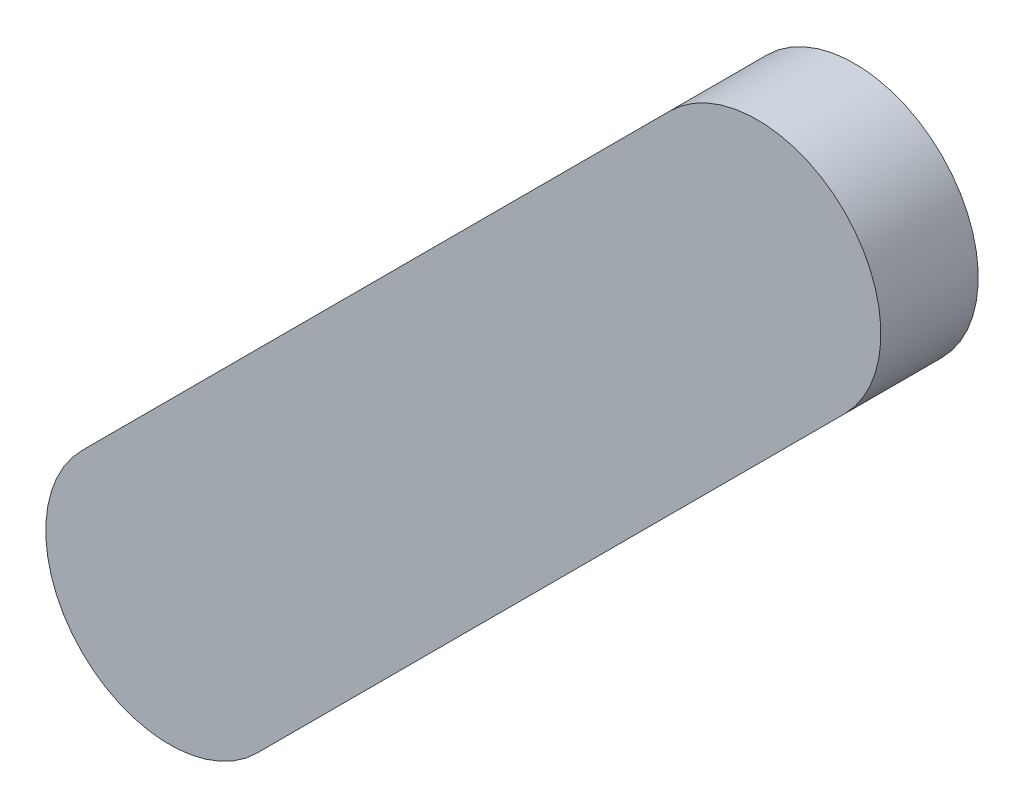
ISO-10303-21;
HEADER;
FILE_DESCRIPTION(('STEP AP214'),'2;1');
FILE_NAME('part.step','',(''),(''),'','','');
FILE_SCHEMA(('AUTOMOTIVE_DESIGN { 1 0 10303 214 1 1 1 1 }'));
ENDSEC;
DATA;
#1=APPLICATION_CONTEXT('core data for automotive mechanical design processes');
#2=APPLICATION_PROTOCOL_DEFINITION('international standard','automotive_design',2000,#1);
#3=PRODUCT_CONTEXT('',#1,'mechanical');
#4=PRODUCT('Part','Part','',(#3));
#5=PRODUCT_RELATED_PRODUCT_CATEGORY('part','',(#4));
#6=PRODUCT_DEFINITION_FORMATION('','',#4);
#7=PRODUCT_DEFINITION_CONTEXT('part definition',#1,'design');
#8=PRODUCT_DEFINITION('design','',#6,#7);
#9=PRODUCT_DEFINITION_SHAPE('','',#8);
#10=(LENGTH_UNIT() NAMED_UNIT(*) SI_UNIT(.MILLI.,.METRE.));
#11=(NAMED_UNIT(*) PLANE_ANGLE_UNIT() SI_UNIT($,.RADIAN.));
#12=(NAMED_UNIT(*) SI_UNIT($,.STERADIAN.) SOLID_ANGLE_UNIT());
#13=UNCERTAINTY_MEASURE_WITH_UNIT(LENGTH_MEASURE(1.E-05),#10,'distance_accuracy_value','');
#14=(GEOMETRIC_REPRESENTATION_CONTEXT(3) GLOBAL_UNCERTAINTY_ASSIGNED_CONTEXT((#13)) GLOBAL_UNIT_ASSIGNED_CONTEXT((#10,
#11,#12)) REPRESENTATION_CONTEXT('',''));
#15=CARTESIAN_POINT('',(0.,0.,0.));
#16=DIRECTION('',(0.,0.,1.));
#17=DIRECTION('',(1.,0.,0.));
#18=AXIS2_PLACEMENT_3D('',#15,#16,#17);
#19=CARTESIAN_POINT('',(103.23858194,112.93777006,0.));
#20=DIRECTION('',(-0.707106781186543,0.707106781186552,0.));
#21=DIRECTION('',(0.707106781186552,0.707106781186543,0.));
#22=AXIS2_PLACEMENT_3D('',#19,#20,#21);
#23=PLANE('',#22);
#24=DIRECTION('',(0.707106781186552,0.707106781186543,0.));
#25=VECTOR('',#24,1.);
#26=CARTESIAN_POINT('',(103.23858194,112.93777006,0.1999996));
#27=LINE('',#26,#25);
#28=CARTESIAN_POINT('',(103.23858194,112.93777006,0.1999996));
#29=VERTEX_POINT('',#28);
#30=CARTESIAN_POINT('',(104.44660594,114.14579406,0.1999996));
#31=VERTEX_POINT('',#30);
#32=EDGE_CURVE('E11',#29,#31,#27,.T.);
#33=ORIENTED_EDGE('',*,*,#32,.F.);
#34=DIRECTION('',(0.,0.,1.));
#35=VECTOR('',#34,1.);
#36=CARTESIAN_POINT('',(103.23858194,112.93777006,0.));
#37=LINE('',#36,#35);
#38=CARTESIAN_POINT('',(103.23858194,112.93777006,0.));
#39=VERTEX_POINT('',#38);
#40=EDGE_CURVE('E24',#39,#29,#37,.T.);
#41=ORIENTED_EDGE('',*,*,#40,.F.);
#42=DIRECTION('',(0.707106781186552,0.707106781186543,0.));
#43=VECTOR('',#42,1.);
#44=CARTESIAN_POINT('',(103.23858194,112.93777006,0.));
#45=LINE('',#44,#43);
#46=CARTESIAN_POINT('',(104.44660594,114.14579406,0.));
#47=VERTEX_POINT('',#46);
#48=EDGE_CURVE('E75',#39,#47,#45,.T.);
#49=ORIENTED_EDGE('',*,*,#48,.T.);
#50=DIRECTION('',(0.,0.,1.));
#51=VECTOR('',#50,1.);
#52=CARTESIAN_POINT('',(104.44660594,114.14579406,0.));
#53=LINE('',#52,#51);
#54=EDGE_CURVE('E37',#47,#31,#53,.T.);
#55=ORIENTED_EDGE('',*,*,#54,.T.);
#56=EDGE_LOOP('',(#33,#41,#49,#55));
#57=FACE_BOUND('',#56,.T.);
#58=ADVANCED_FACE('F17',(#57),#23,.F.);
#59=CARTESIAN_POINT('',(104.267,114.3254,0.));
#60=DIRECTION('',(0.,0.,-1.));
#61=DIRECTION('',(0.707106781186548,-0.707106781186548,0.));
#62=AXIS2_PLACEMENT_3D('',#59,#60,#61);
#63=CYLINDRICAL_SURFACE('',#62,0.254001156230771);
#64=CARTESIAN_POINT('',(104.267,114.3254,0.1999996));
#65=DIRECTION('',(0.,0.,1.));
#66=DIRECTION('',(0.707106781186548,-0.707106781186548,0.));
#67=AXIS2_PLACEMENT_3D('',#64,#65,#66);
#68=CIRCLE('',#67,0.254001156230771);
#69=CARTESIAN_POINT('',(104.08739406,114.50500594,0.1999996));
#70=VERTEX_POINT('',#69);
#71=EDGE_CURVE('E83',#31,#70,#68,.T.);
#72=ORIENTED_EDGE('',*,*,#71,.F.);
#73=ORIENTED_EDGE('',*,*,#54,.F.);
#74=CARTESIAN_POINT('',(104.267,114.3254,0.));
#75=DIRECTION('',(0.,0.,1.));
#76=DIRECTION('',(0.707106781186548,-0.707106781186548,0.));
#77=AXIS2_PLACEMENT_3D('',#74,#75,#76);
#78=CIRCLE('',#77,0.254001156230771);
#79=CARTESIAN_POINT('',(104.08739406,114.50500594,0.));
#80=VERTEX_POINT('',#79);
#81=EDGE_CURVE('E81',#47,#80,#78,.T.);
#82=ORIENTED_EDGE('',*,*,#81,.T.);
#83=DIRECTION('',(0.,0.,1.));
#84=VECTOR('',#83,1.);
#85=CARTESIAN_POINT('',(104.08739406,114.50500594,0.));
#86=LINE('',#85,#84);
#87=EDGE_CURVE('E67',#80,#70,#86,.T.);
#88=ORIENTED_EDGE('',*,*,#87,.T.);
#89=EDGE_LOOP('',(#72,#73,#82,#88));
#90=FACE_BOUND('',#89,.T.);
#91=ADVANCED_FACE('F89',(#90),#63,.T.);
#92=CARTESIAN_POINT('',(104.08739406,114.50500594,0.));
#93=DIRECTION('',(0.707106781186548,-0.707106781186548,0.));
#94=DIRECTION('',(-0.707106781186548,-0.707106781186548,0.));
#95=AXIS2_PLACEMENT_3D('',#92,#93,#94);
#96=PLANE('',#95);
#97=DIRECTION('',(-0.707106781186548,-0.707106781186548,0.));
#98=VECTOR('',#97,1.);
#99=CARTESIAN_POINT('',(104.08739406,114.50500594,0.1999996));
#100=LINE('',#99,#98);
#101=CARTESIAN_POINT('',(102.87937006,113.29698194,0.1999996));
#102=VERTEX_POINT('',#101);
#103=EDGE_CURVE('E71',#70,#102,#100,.T.);
#104=ORIENTED_EDGE('',*,*,#103,.F.);
#105=ORIENTED_EDGE('',*,*,#87,.F.);
#106=DIRECTION('',(-0.707106781186548,-0.707106781186548,0.));
#107=VECTOR('',#106,1.);
#108=CARTESIAN_POINT('',(104.08739406,114.50500594,0.));
#109=LINE('',#108,#107);
#110=CARTESIAN_POINT('',(102.87937006,113.29698194,0.));
#111=VERTEX_POINT('',#110);
#112=EDGE_CURVE('E63',#80,#111,#109,.T.);
#113=ORIENTED_EDGE('',*,*,#112,.T.);
#114=DIRECTION('',(0.,0.,1.));
#115=VECTOR('',#114,1.);
#116=CARTESIAN_POINT('',(102.87937006,113.29698194,0.));
#117=LINE('',#116,#115);
#118=EDGE_CURVE('E53',#111,#102,#117,.T.);
#119=ORIENTED_EDGE('',*,*,#118,.T.);
#120=EDGE_LOOP('',(#104,#105,#113,#119));
#121=FACE_BOUND('',#120,.T.);
#122=ADVANCED_FACE('F66',(#121),#96,.F.);
#123=CARTESIAN_POINT('',(103.058976,113.117376,0.));
#124=DIRECTION('',(0.,0.,-1.));
#125=DIRECTION('',(-0.707106781186548,0.707106781186548,0.));
#126=AXIS2_PLACEMENT_3D('',#123,#124,#125);
#127=CYLINDRICAL_SURFACE('',#126,0.254001156230768);
#128=CARTESIAN_POINT('',(103.058976,113.117376,0.1999996));
#129=DIRECTION('',(0.,0.,1.));
#130=DIRECTION('',(-0.707106781186548,0.707106781186548,0.));
#131=AXIS2_PLACEMENT_3D('',#128,#129,#130);
#132=CIRCLE('',#131,0.254001156230768);
#133=EDGE_CURVE('E59',#102,#29,#132,.T.);
#134=ORIENTED_EDGE('',*,*,#133,.F.);
#135=ORIENTED_EDGE('',*,*,#118,.F.);
#136=CARTESIAN_POINT('',(103.058976,113.117376,0.));
#137=DIRECTION('',(0.,0.,1.));
#138=DIRECTION('',(-0.707106781186548,0.707106781186548,0.));
#139=AXIS2_PLACEMENT_3D('',#136,#137,#138);
#140=CIRCLE('',#139,0.254001156230768);
#141=EDGE_CURVE('E57',#111,#39,#140,.T.);
#142=ORIENTED_EDGE('',*,*,#141,.T.);
#143=ORIENTED_EDGE('',*,*,#40,.T.);
#144=EDGE_LOOP('',(#134,#135,#142,#143));
#145=FACE_BOUND('',#144,.T.);
#146=ADVANCED_FACE('F55',(#145),#127,.T.);
#147=CARTESIAN_POINT('',(103.23858194,112.93777006,0.));
#148=DIRECTION('',(0.,0.,-1.));
#149=DIRECTION('',(-1.,0.,0.));
#150=AXIS2_PLACEMENT_3D('',#147,#148,#149);
#151=PLANE('',#150);
#152=ORIENTED_EDGE('',*,*,#141,.F.);
#153=ORIENTED_EDGE('',*,*,#112,.F.);
#154=ORIENTED_EDGE('',*,*,#81,.F.);
#155=ORIENTED_EDGE('',*,*,#48,.F.);
#156=EDGE_LOOP('',(#152,#153,#154,#155));
#157=FACE_BOUND('',#156,.T.);
#158=ADVANCED_FACE('F74',(#157),#151,.T.);
#159=CARTESIAN_POINT('',(103.23858194,112.93777006,0.1999996));
#160=DIRECTION('',(0.,0.,-1.));
#161=DIRECTION('',(-1.,0.,0.));
#162=AXIS2_PLACEMENT_3D('',#159,#160,#161);
#163=PLANE('',#162);
#164=ORIENTED_EDGE('',*,*,#32,.T.);
#165=ORIENTED_EDGE('',*,*,#71,.T.);
#166=ORIENTED_EDGE('',*,*,#103,.T.);
#167=ORIENTED_EDGE('',*,*,#133,.T.);
#168=EDGE_LOOP('',(#164,#165,#166,#167));
#169=FACE_BOUND('',#168,.T.);
#170=ADVANCED_FACE('F91',(#169),#163,.F.);
#171=CLOSED_SHELL('',(#58,#91,#122,#146,#158,#170));
#172=MANIFOLD_SOLID_BREP('B1',#171);
#173=ADVANCED_BREP_SHAPE_REPRESENTATION('',(#18,#172),#14);
#174=SHAPE_DEFINITION_REPRESENTATION(#9,#173);
ENDSEC;
END-ISO-10303-21;
